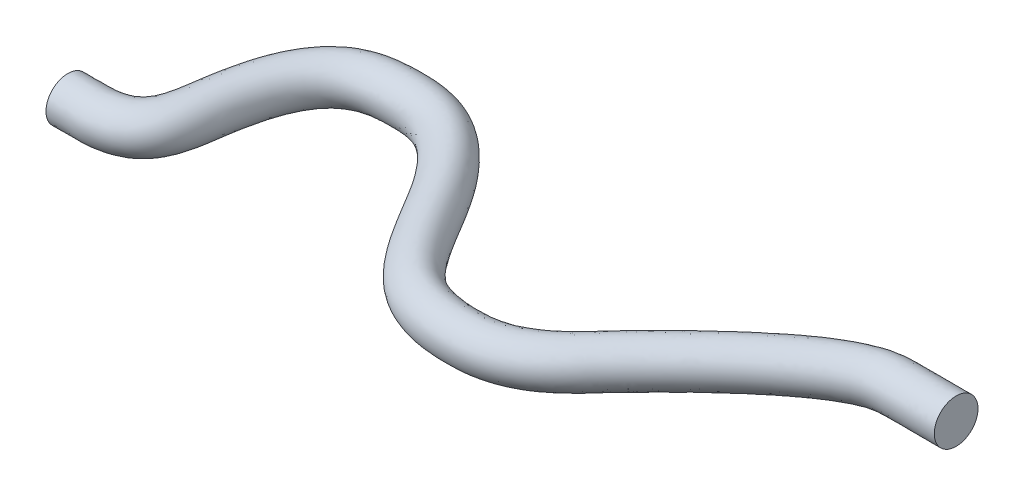
ISO-10303-21;
HEADER;
FILE_DESCRIPTION(('STEP AP214'),'2;1');
FILE_NAME('part.step','',(''),(''),'','','');
FILE_SCHEMA(('AUTOMOTIVE_DESIGN { 1 0 10303 214 1 1 1 1 }'));
ENDSEC;
DATA;
#1=APPLICATION_CONTEXT('core data for automotive mechanical design processes');
#2=APPLICATION_PROTOCOL_DEFINITION('international standard','automotive_design',2000,#1);
#3=PRODUCT_CONTEXT('',#1,'mechanical');
#4=PRODUCT('Part','Part','',(#3));
#5=PRODUCT_RELATED_PRODUCT_CATEGORY('part','',(#4));
#6=PRODUCT_DEFINITION_FORMATION('','',#4);
#7=PRODUCT_DEFINITION_CONTEXT('part definition',#1,'design');
#8=PRODUCT_DEFINITION('design','',#6,#7);
#9=PRODUCT_DEFINITION_SHAPE('','',#8);
#10=(LENGTH_UNIT() NAMED_UNIT(*) SI_UNIT(.MILLI.,.METRE.));
#11=(NAMED_UNIT(*) PLANE_ANGLE_UNIT() SI_UNIT($,.RADIAN.));
#12=(NAMED_UNIT(*) SI_UNIT($,.STERADIAN.) SOLID_ANGLE_UNIT());
#13=UNCERTAINTY_MEASURE_WITH_UNIT(LENGTH_MEASURE(1.E-05),#10,'distance_accuracy_value','');
#14=(GEOMETRIC_REPRESENTATION_CONTEXT(3) GLOBAL_UNCERTAINTY_ASSIGNED_CONTEXT((#13)) GLOBAL_UNIT_ASSIGNED_CONTEXT((#10,
#11,#12)) REPRESENTATION_CONTEXT('',''));
#15=CARTESIAN_POINT('',(0.,0.,0.));
#16=DIRECTION('',(0.,0.,1.));
#17=DIRECTION('',(1.,0.,0.));
#18=AXIS2_PLACEMENT_3D('',#15,#16,#17);
#19=CARTESIAN_POINT('',(0.,0.,2.));
#20=DIRECTION('',(-1.,0.,0.));
#21=DIRECTION('',(0.,0.,1.));
#22=AXIS2_PLACEMENT_3D('',#19,#20,#21);
#23=PLANE('',#22);
#24=CARTESIAN_POINT('',(0.,0.,0.));
#25=DIRECTION('',(1.,0.,0.));
#26=DIRECTION('',(0.,0.,-1.));
#27=AXIS2_PLACEMENT_3D('',#24,#25,#26);
#28=CIRCLE('',#27,2.);
#29=CARTESIAN_POINT('',(0.,0.,-2.));
#30=VERTEX_POINT('',#29);
#31=EDGE_CURVE('E53',#30,#30,#28,.T.);
#32=ORIENTED_EDGE('',*,*,#31,.F.);
#33=EDGE_LOOP('',(#32));
#34=FACE_BOUND('',#33,.T.);
#35=ADVANCED_FACE('F49',(#34),#23,.T.);
#36=CARTESIAN_POINT('',(66.1604814361651,0.,-13.0844175366333));
#37=DIRECTION('',(-1.,0.,0.));
#38=DIRECTION('',(0.,0.,1.));
#39=AXIS2_PLACEMENT_3D('',#36,#37,#38);
#40=PLANE('',#39);
#41=CARTESIAN_POINT('',(66.1604814361651,0.,-15.0844175366333));
#42=DIRECTION('',(-1.,0.,0.));
#43=DIRECTION('',(0.,0.,1.));
#44=AXIS2_PLACEMENT_3D('',#41,#42,#43);
#45=CIRCLE('',#44,2.);
#46=CARTESIAN_POINT('',(66.1604814361651,0.,-13.0844175366333));
#47=VERTEX_POINT('',#46);
#48=EDGE_CURVE('E11',#47,#47,#45,.T.);
#49=ORIENTED_EDGE('',*,*,#48,.F.);
#50=EDGE_LOOP('',(#49));
#51=FACE_BOUND('',#50,.T.);
#52=ADVANCED_FACE('F51',(#51),#40,.F.);
#53=CARTESIAN_POINT('',(0.,0.,-2.));
#54=CARTESIAN_POINT('',(0.576247341707407,0.,-1.99800129089098));
#55=CARTESIAN_POINT('',(1.3921594663181,0.,-2.01440466065576));
#56=CARTESIAN_POINT('',(2.17657091953829,0.,-2.01173545523365));
#57=CARTESIAN_POINT('',(2.62660835659001,0.,-1.98740789094828));
#58=CARTESIAN_POINT('',(3.30942954225005,0.,-2.06714564380435));
#59=CARTESIAN_POINT('',(3.79208372886148,0.,-2.21753338210752));
#60=CARTESIAN_POINT('',(3.99940599652082,0.,-2.3014231540369));
#61=CARTESIAN_POINT('',(4.14524590631426,0.,-2.38286606250441));
#62=CARTESIAN_POINT('',(4.30282558564287,0.,-2.50333943287402));
#63=CARTESIAN_POINT('',(4.50610598378241,0.,-2.73079492712394));
#64=CARTESIAN_POINT('',(4.7720968761298,0.,-3.2199578414801));
#65=CARTESIAN_POINT('',(5.10815723379101,0.,-4.44123534577987));
#66=CARTESIAN_POINT('',(5.30987449978381,0.,-6.14646287324118));
#67=CARTESIAN_POINT('',(5.66106121168746,0.,-8.15065923165252));
#68=CARTESIAN_POINT('',(6.04730328755896,0.,-9.83622078319194));
#69=CARTESIAN_POINT('',(6.76473971891991,0.,-12.0143126917871));
#70=CARTESIAN_POINT('',(7.73068238147757,0.,-13.8216387441997));
#71=CARTESIAN_POINT('',(8.98826168346513,0.,-15.267574026683));
#72=CARTESIAN_POINT('',(10.1223028521453,0.,-16.1577499683015));
#73=CARTESIAN_POINT('',(11.2972850092684,0.,-16.7657066545634));
#74=CARTESIAN_POINT('',(12.4389459343736,0.,-17.1324988439765));
#75=CARTESIAN_POINT('',(13.6904177543395,0.,-17.3524981694854));
#76=CARTESIAN_POINT('',(14.7017533703688,0.,-17.4102655293658));
#77=CARTESIAN_POINT('',(15.6669000401161,0.,-17.4282807444468));
#78=CARTESIAN_POINT('',(16.4789542398157,0.,-17.411045356171));
#79=CARTESIAN_POINT('',(17.5029694882764,0.,-17.3220116788886));
#80=CARTESIAN_POINT('',(18.6412976794965,0.,-17.1168479870707));
#81=CARTESIAN_POINT('',(20.0094709313657,0.,-16.6532843383645));
#82=CARTESIAN_POINT('',(21.4066836458121,0.,-15.9071458945275));
#83=CARTESIAN_POINT('',(22.803114673683,0.,-14.8518710039708));
#84=CARTESIAN_POINT('',(24.2000986434754,0.,-13.4589260781223));
#85=CARTESIAN_POINT('',(25.4768460081553,0.,-11.8648524004868));
#86=CARTESIAN_POINT('',(26.4473000656231,0.,-10.4329215442212));
#87=CARTESIAN_POINT('',(27.4666128914372,0.,-8.79774982098106));
#88=CARTESIAN_POINT('',(28.6673017882565,0.,-6.73495531726025));
#89=CARTESIAN_POINT('',(30.3406226059038,0.,-4.19383862201362));
#90=CARTESIAN_POINT('',(31.4513420326102,0.,-3.00366012658609));
#91=CARTESIAN_POINT('',(32.5556577003092,0.,-2.13064495759472));
#92=CARTESIAN_POINT('',(33.6691650821633,0.,-1.56872707707272));
#93=CARTESIAN_POINT('',(35.3991370597416,0.,-1.23469488561184));
#94=CARTESIAN_POINT('',(36.8929676916229,0.,-1.15663794314645));
#95=CARTESIAN_POINT('',(38.6698211128305,0.,-1.18945238553637));
#96=CARTESIAN_POINT('',(40.7571448276082,0.,-2.01518171579414));
#97=CARTESIAN_POINT('',(42.3110169786028,0.,-3.36030563334392));
#98=CARTESIAN_POINT('',(43.0488043562348,0.,-4.11499723280239));
#99=CARTESIAN_POINT('',(44.0585737782881,0.,-5.21009047202035));
#100=CARTESIAN_POINT('',(46.7686946432867,0.,-8.08876755763583));
#101=CARTESIAN_POINT('',(51.3476063864162,0.,-12.3576681673767));
#102=CARTESIAN_POINT('',(55.4751524289029,0.,-15.4401279815693));
#103=CARTESIAN_POINT('',(58.0738870721952,0.,-16.6343376480373));
#104=CARTESIAN_POINT('',(59.9896430588437,0.,-17.0870953393976));
#105=CARTESIAN_POINT('',(61.0690109853259,0.,-17.0990428524457));
#106=CARTESIAN_POINT('',(62.5903548071873,0.,-17.087958668524));
#107=CARTESIAN_POINT('',(63.8865238935633,0.,-17.0903161223702));
#108=CARTESIAN_POINT('',(65.2856768985329,0.,-17.0850145857712));
#109=CARTESIAN_POINT('',(66.1604814361651,0.,-17.0844175366333));
#110=CARTESIAN_POINT('',(0.,4.,-2.));
#111=CARTESIAN_POINT('',(0.576247341707407,4.,-1.99800129089098));
#112=CARTESIAN_POINT('',(1.3921594663181,4.,-2.01440466065576));
#113=CARTESIAN_POINT('',(2.17657091953829,4.,-2.01173545523365));
#114=CARTESIAN_POINT('',(2.62660835659001,4.,-1.98740789094828));
#115=CARTESIAN_POINT('',(3.30942954225005,4.,-2.06714564380435));
#116=CARTESIAN_POINT('',(3.79208372886148,4.,-2.21753338210752));
#117=CARTESIAN_POINT('',(3.99940599652082,4.,-2.3014231540369));
#118=CARTESIAN_POINT('',(4.14524590631426,4.,-2.38286606250441));
#119=CARTESIAN_POINT('',(4.30282558564287,4.,-2.50333943287402));
#120=CARTESIAN_POINT('',(4.50610598378241,4.,-2.73079492712394));
#121=CARTESIAN_POINT('',(4.7720968761298,4.,-3.2199578414801));
#122=CARTESIAN_POINT('',(5.10815723379101,4.,-4.44123534577987));
#123=CARTESIAN_POINT('',(5.30987449978381,4.,-6.14646287324117));
#124=CARTESIAN_POINT('',(5.66106121168746,4.,-8.15065923165252));
#125=CARTESIAN_POINT('',(6.04730328755896,4.,-9.83622078319194));
#126=CARTESIAN_POINT('',(6.76473971891991,4.,-12.0143126917871));
#127=CARTESIAN_POINT('',(7.73068238147756,4.,-13.8216387441997));
#128=CARTESIAN_POINT('',(8.98826168346513,4.,-15.267574026683));
#129=CARTESIAN_POINT('',(10.1223028521453,4.,-16.1577499683015));
#130=CARTESIAN_POINT('',(11.2972850092685,4.,-16.7657066545634));
#131=CARTESIAN_POINT('',(12.4389459343736,4.,-17.1324988439765));
#132=CARTESIAN_POINT('',(13.6904177543395,4.,-17.3524981694854));
#133=CARTESIAN_POINT('',(14.7017533703688,4.,-17.4102655293659));
#134=CARTESIAN_POINT('',(15.6669000401161,4.,-17.4282807444468));
#135=CARTESIAN_POINT('',(16.4789542398157,4.,-17.411045356171));
#136=CARTESIAN_POINT('',(17.5029694882764,4.,-17.3220116788886));
#137=CARTESIAN_POINT('',(18.6412976794965,4.,-17.1168479870707));
#138=CARTESIAN_POINT('',(20.0094709313657,4.,-16.6532843383645));
#139=CARTESIAN_POINT('',(21.4066836458121,4.,-15.9071458945275));
#140=CARTESIAN_POINT('',(22.803114673683,4.,-14.8518710039708));
#141=CARTESIAN_POINT('',(24.2000986434754,4.,-13.4589260781223));
#142=CARTESIAN_POINT('',(25.4768460081553,4.,-11.8648524004868));
#143=CARTESIAN_POINT('',(26.4473000656231,4.,-10.4329215442212));
#144=CARTESIAN_POINT('',(27.4666128914372,4.,-8.79774982098107));
#145=CARTESIAN_POINT('',(28.6673017882565,4.,-6.73495531726025));
#146=CARTESIAN_POINT('',(30.3406226059038,4.,-4.19383862201362));
#147=CARTESIAN_POINT('',(31.4513420326102,4.,-3.00366012658609));
#148=CARTESIAN_POINT('',(32.5556577003092,4.,-2.13064495759472));
#149=CARTESIAN_POINT('',(33.6691650821633,4.,-1.56872707707272));
#150=CARTESIAN_POINT('',(35.3991370597416,4.,-1.23469488561184));
#151=CARTESIAN_POINT('',(36.8929676916228,4.,-1.15663794314645));
#152=CARTESIAN_POINT('',(38.6698211128305,4.,-1.18945238553637));
#153=CARTESIAN_POINT('',(40.7571448276083,4.,-2.01518171579414));
#154=CARTESIAN_POINT('',(42.3110169786028,4.,-3.36030563334392));
#155=CARTESIAN_POINT('',(43.0488043562348,4.,-4.11499723280239));
#156=CARTESIAN_POINT('',(44.058573778288,4.,-5.21009047202035));
#157=CARTESIAN_POINT('',(46.7686946432867,4.,-8.08876755763583));
#158=CARTESIAN_POINT('',(51.3476063864162,4.,-12.3576681673767));
#159=CARTESIAN_POINT('',(55.4751524289029,4.,-15.4401279815693));
#160=CARTESIAN_POINT('',(58.0738870721952,4.,-16.6343376480373));
#161=CARTESIAN_POINT('',(59.9896430588437,4.,-17.0870953393976));
#162=CARTESIAN_POINT('',(61.0690109853259,4.,-17.0990428524457));
#163=CARTESIAN_POINT('',(62.5903548071873,4.,-17.087958668524));
#164=CARTESIAN_POINT('',(63.8865238935633,4.,-17.0903161223702));
#165=CARTESIAN_POINT('',(65.2856768985329,4.,-17.0850145857712));
#166=CARTESIAN_POINT('',(66.1604814361651,4.,-17.0844175366333));
#167=CARTESIAN_POINT('',(0.,4.,2.));
#168=CARTESIAN_POINT('',(0.516329915263041,4.,1.99800129089098));
#169=CARTESIAN_POINT('',(1.25551830624878,4.,1.97647926251972));
#170=CARTESIAN_POINT('',(2.26432235884609,4.,1.99626101447362));
#171=CARTESIAN_POINT('',(2.96716077920261,4.,2.0138336417967));
#172=CARTESIAN_POINT('',(4.06092971499091,4.,1.87570799372577));
#173=CARTESIAN_POINT('',(5.07186404650313,4.,1.58313452454297));
#174=CARTESIAN_POINT('',(5.71091256510153,4.,1.317725381308));
#175=CARTESIAN_POINT('',(6.33595953164428,4.,0.989833294090546));
#176=CARTESIAN_POINT('',(7.06073360865654,4.,0.428122353443539));
#177=CARTESIAN_POINT('',(7.91592107344362,4.,-0.549316605771048));
#178=CARTESIAN_POINT('',(8.57445650460704,4.,-1.88728075622531));
#179=CARTESIAN_POINT('',(9.07149777121769,4.,-3.84155649544665));
#180=CARTESIAN_POINT('',(9.28554003913438,4.,-5.60414086960802));
#181=CARTESIAN_POINT('',(9.58285672491652,4.,-7.36633213596294));
#182=CARTESIAN_POINT('',(9.90742727920916,4.,-8.77568945417334));
#183=CARTESIAN_POINT('',(10.465948589674,4.,-10.4499827280811));
#184=CARTESIAN_POINT('',(11.1075817583047,4.,-11.6074670245137));
#185=CARTESIAN_POINT('',(11.7768063663895,4.,-12.3659485225979));
#186=CARTESIAN_POINT('',(12.3061669828393,4.,-12.7778452664829));
#187=CARTESIAN_POINT('',(12.8366316719826,4.,-13.053671489673));
#188=CARTESIAN_POINT('',(13.3975818567099,4.,-13.235623701661));
#189=CARTESIAN_POINT('',(14.0950526326662,4.,-13.3653460257203));
#190=CARTESIAN_POINT('',(14.8776042986845,4.,-13.4049976795017));
#191=CARTESIAN_POINT('',(15.677620257616,4.,-13.4297518711169));
#192=CARTESIAN_POINT('',(16.2837068253218,4.,-13.4134494854446));
#193=CARTESIAN_POINT('',(16.9700838804868,4.,-13.3517217239321));
#194=CARTESIAN_POINT('',(17.6423104845553,4.,-13.228157357761));
#195=CARTESIAN_POINT('',(18.4008595852879,4.,-12.9708956336827));
#196=CARTESIAN_POINT('',(19.2206956385393,4.,-12.5375140557608));
#197=CARTESIAN_POINT('',(20.1469067622328,4.,-11.8442008561434));
#198=CARTESIAN_POINT('',(21.1934252966435,4.,-10.809116203961));
#199=CARTESIAN_POINT('',(22.2519737334773,4.,-9.49012900677604));
#200=CARTESIAN_POINT('',(23.087862852319,4.,-8.26196752261252));
#201=CARTESIAN_POINT('',(24.0220234635184,4.,-6.76132259358991));
#202=CARTESIAN_POINT('',(25.2400049185952,4.,-4.67550885243034));
#203=CARTESIAN_POINT('',(27.0874514450531,4.,-1.83827541190514));
#204=CARTESIAN_POINT('',(28.6593300563674,4.,-0.0999635902596704));
#205=CARTESIAN_POINT('',(30.4333159896534,4.,1.27899530590162));
#206=CARTESIAN_POINT('',(32.4488536887708,4.,2.3029214375405));
#207=CARTESIAN_POINT('',(34.8983342383895,4.,2.75756458769308));
#208=CARTESIAN_POINT('',(37.056149292774,4.,2.83164126585353));
#209=CARTESIAN_POINT('',(39.6861285216008,4.,2.68377086122828));
#210=CARTESIAN_POINT('',(42.8761196602072,4.,1.46797969886257));
#211=CARTESIAN_POINT('',(45.0424016964653,4.,-0.399804637498555));
#212=CARTESIAN_POINT('',(45.9733095091834,4.,-1.38618555186537));
#213=CARTESIAN_POINT('',(47.0608598043323,4.,-2.5723502734653));
#214=CARTESIAN_POINT('',(49.5665538428836,4.,-5.20748977682932));
#215=CARTESIAN_POINT('',(53.9181511761186,4.,-9.32631166331296));
#216=CARTESIAN_POINT('',(57.786597490147,4.,-12.0904011113325));
#217=CARTESIAN_POINT('',(59.3196423589111,4.,-12.8425916225017));
#218=CARTESIAN_POINT('',(60.4988212695535,4.,-13.0878967138161));
#219=CARTESIAN_POINT('',(61.2398401253435,4.,-13.0839540935642));
#220=CARTESIAN_POINT('',(62.4776838242886,4.,-13.0981423441664));
#221=CARTESIAN_POINT('',(63.9062111566503,4.,-13.0867338275431));
#222=CARTESIAN_POINT('',(65.2922393195619,4.,-13.0838204874954));
#223=CARTESIAN_POINT('',(66.1604814361651,4.,-13.0844175366333));
#224=CARTESIAN_POINT('',(0.,0.,2.));
#225=CARTESIAN_POINT('',(0.516329915263041,0.,1.99800129089098));
#226=CARTESIAN_POINT('',(1.25551830624878,0.,1.97647926251972));
#227=CARTESIAN_POINT('',(2.26432235884609,0.,1.99626101447362));
#228=CARTESIAN_POINT('',(2.96716077920261,0.,2.0138336417967));
#229=CARTESIAN_POINT('',(4.06092971499091,0.,1.87570799372577));
#230=CARTESIAN_POINT('',(5.07186404650313,0.,1.58313452454297));
#231=CARTESIAN_POINT('',(5.71091256510153,0.,1.317725381308));
#232=CARTESIAN_POINT('',(6.33595953164428,0.,0.989833294090546));
#233=CARTESIAN_POINT('',(7.06073360865654,0.,0.428122353443539));
#234=CARTESIAN_POINT('',(7.91592107344363,0.,-0.549316605771047));
#235=CARTESIAN_POINT('',(8.57445650460704,0.,-1.88728075622531));
#236=CARTESIAN_POINT('',(9.07149777121769,0.,-3.84155649544665));
#237=CARTESIAN_POINT('',(9.28554003913439,0.,-5.60414086960802));
#238=CARTESIAN_POINT('',(9.58285672491652,0.,-7.36633213596294));
#239=CARTESIAN_POINT('',(9.90742727920916,0.,-8.77568945417334));
#240=CARTESIAN_POINT('',(10.465948589674,0.,-10.4499827280811));
#241=CARTESIAN_POINT('',(11.1075817583047,0.,-11.6074670245137));
#242=CARTESIAN_POINT('',(11.7768063663895,0.,-12.3659485225979));
#243=CARTESIAN_POINT('',(12.3061669828393,0.,-12.7778452664829));
#244=CARTESIAN_POINT('',(12.8366316719826,0.,-13.053671489673));
#245=CARTESIAN_POINT('',(13.3975818567099,0.,-13.235623701661));
#246=CARTESIAN_POINT('',(14.0950526326662,0.,-13.3653460257203));
#247=CARTESIAN_POINT('',(14.8776042986845,0.,-13.4049976795017));
#248=CARTESIAN_POINT('',(15.677620257616,0.,-13.4297518711169));
#249=CARTESIAN_POINT('',(16.2837068253218,0.,-13.4134494854446));
#250=CARTESIAN_POINT('',(16.9700838804868,0.,-13.3517217239321));
#251=CARTESIAN_POINT('',(17.6423104845553,0.,-13.228157357761));
#252=CARTESIAN_POINT('',(18.4008595852879,0.,-12.9708956336827));
#253=CARTESIAN_POINT('',(19.2206956385392,0.,-12.5375140557608));
#254=CARTESIAN_POINT('',(20.1469067622328,0.,-11.8442008561434));
#255=CARTESIAN_POINT('',(21.1934252966435,0.,-10.809116203961));
#256=CARTESIAN_POINT('',(22.2519737334773,0.,-9.49012900677604));
#257=CARTESIAN_POINT('',(23.087862852319,0.,-8.26196752261252));
#258=CARTESIAN_POINT('',(24.0220234635184,0.,-6.7613225935899));
#259=CARTESIAN_POINT('',(25.2400049185952,0.,-4.67550885243034));
#260=CARTESIAN_POINT('',(27.0874514450531,0.,-1.83827541190514));
#261=CARTESIAN_POINT('',(28.6593300563674,0.,-0.0999635902596701));
#262=CARTESIAN_POINT('',(30.4333159896534,0.,1.27899530590162));
#263=CARTESIAN_POINT('',(32.4488536887708,0.,2.3029214375405));
#264=CARTESIAN_POINT('',(34.8983342383895,0.,2.75756458769308));
#265=CARTESIAN_POINT('',(37.056149292774,0.,2.83164126585353));
#266=CARTESIAN_POINT('',(39.6861285216008,0.,2.68377086122828));
#267=CARTESIAN_POINT('',(42.8761196602072,0.,1.46797969886257));
#268=CARTESIAN_POINT('',(45.0424016964653,0.,-0.399804637498555));
#269=CARTESIAN_POINT('',(45.9733095091834,0.,-1.38618555186537));
#270=CARTESIAN_POINT('',(47.0608598043323,0.,-2.5723502734653));
#271=CARTESIAN_POINT('',(49.5665538428837,0.,-5.20748977682932));
#272=CARTESIAN_POINT('',(53.9181511761186,0.,-9.32631166331295));
#273=CARTESIAN_POINT('',(57.7865974901471,0.,-12.0904011113325));
#274=CARTESIAN_POINT('',(59.3196423589111,0.,-12.8425916225017));
#275=CARTESIAN_POINT('',(60.4988212695535,0.,-13.0878967138161));
#276=CARTESIAN_POINT('',(61.2398401253435,0.,-13.0839540935642));
#277=CARTESIAN_POINT('',(62.4776838242886,0.,-13.0981423441664));
#278=CARTESIAN_POINT('',(63.9062111566503,0.,-13.0867338275431));
#279=CARTESIAN_POINT('',(65.2922393195619,0.,-13.0838204874954));
#280=CARTESIAN_POINT('',(66.1604814361651,0.,-13.0844175366333));
#281=CARTESIAN_POINT('',(0.,-4.,2.));
#282=CARTESIAN_POINT('',(0.516329915263041,-4.,1.99800129089098));
#283=CARTESIAN_POINT('',(1.25551830624878,-4.,1.97647926251972));
#284=CARTESIAN_POINT('',(2.26432235884609,-4.,1.99626101447362));
#285=CARTESIAN_POINT('',(2.96716077920261,-4.,2.0138336417967));
#286=CARTESIAN_POINT('',(4.06092971499091,-4.,1.87570799372577));
#287=CARTESIAN_POINT('',(5.07186404650313,-4.,1.58313452454297));
#288=CARTESIAN_POINT('',(5.71091256510153,-4.,1.317725381308));
#289=CARTESIAN_POINT('',(6.33595953164428,-4.,0.989833294090547));
#290=CARTESIAN_POINT('',(7.06073360865654,-4.,0.428122353443539));
#291=CARTESIAN_POINT('',(7.91592107344362,-4.,-0.549316605771047));
#292=CARTESIAN_POINT('',(8.57445650460704,-4.,-1.88728075622531));
#293=CARTESIAN_POINT('',(9.07149777121769,-4.,-3.84155649544665));
#294=CARTESIAN_POINT('',(9.28554003913438,-4.,-5.60414086960802));
#295=CARTESIAN_POINT('',(9.58285672491652,-4.,-7.36633213596294));
#296=CARTESIAN_POINT('',(9.90742727920916,-4.,-8.77568945417334));
#297=CARTESIAN_POINT('',(10.465948589674,-4.,-10.4499827280811));
#298=CARTESIAN_POINT('',(11.1075817583047,-4.,-11.6074670245137));
#299=CARTESIAN_POINT('',(11.7768063663895,-4.,-12.3659485225979));
#300=CARTESIAN_POINT('',(12.3061669828393,-4.,-12.7778452664829));
#301=CARTESIAN_POINT('',(12.8366316719826,-4.,-13.053671489673));
#302=CARTESIAN_POINT('',(13.3975818567099,-4.,-13.235623701661));
#303=CARTESIAN_POINT('',(14.0950526326662,-4.,-13.3653460257203));
#304=CARTESIAN_POINT('',(14.8776042986845,-4.,-13.4049976795017));
#305=CARTESIAN_POINT('',(15.677620257616,-4.,-13.4297518711169));
#306=CARTESIAN_POINT('',(16.2837068253218,-4.,-13.4134494854446));
#307=CARTESIAN_POINT('',(16.9700838804868,-4.,-13.3517217239321));
#308=CARTESIAN_POINT('',(17.6423104845553,-4.,-13.228157357761));
#309=CARTESIAN_POINT('',(18.4008595852879,-4.,-12.9708956336827));
#310=CARTESIAN_POINT('',(19.2206956385393,-4.,-12.5375140557608));
#311=CARTESIAN_POINT('',(20.1469067622328,-4.,-11.8442008561434));
#312=CARTESIAN_POINT('',(21.1934252966435,-4.,-10.809116203961));
#313=CARTESIAN_POINT('',(22.2519737334773,-4.,-9.49012900677604));
#314=CARTESIAN_POINT('',(23.087862852319,-4.,-8.26196752261252));
#315=CARTESIAN_POINT('',(24.0220234635184,-4.,-6.76132259358991));
#316=CARTESIAN_POINT('',(25.2400049185952,-4.,-4.67550885243034));
#317=CARTESIAN_POINT('',(27.0874514450531,-4.,-1.83827541190514));
#318=CARTESIAN_POINT('',(28.6593300563674,-4.,-0.09996359025967));
#319=CARTESIAN_POINT('',(30.4333159896534,-4.,1.27899530590162));
#320=CARTESIAN_POINT('',(32.4488536887708,-4.,2.3029214375405));
#321=CARTESIAN_POINT('',(34.8983342383895,-4.,2.75756458769308));
#322=CARTESIAN_POINT('',(37.056149292774,-4.,2.83164126585353));
#323=CARTESIAN_POINT('',(39.6861285216008,-4.,2.68377086122828));
#324=CARTESIAN_POINT('',(42.8761196602072,-4.,1.46797969886257));
#325=CARTESIAN_POINT('',(45.0424016964653,-4.,-0.399804637498555));
#326=CARTESIAN_POINT('',(45.9733095091834,-4.,-1.38618555186537));
#327=CARTESIAN_POINT('',(47.0608598043323,-4.,-2.5723502734653));
#328=CARTESIAN_POINT('',(49.5665538428836,-4.,-5.20748977682932));
#329=CARTESIAN_POINT('',(53.9181511761186,-4.,-9.32631166331296));
#330=CARTESIAN_POINT('',(57.786597490147,-4.,-12.0904011113325));
#331=CARTESIAN_POINT('',(59.3196423589111,-4.,-12.8425916225017));
#332=CARTESIAN_POINT('',(60.4988212695535,-4.,-13.0878967138161));
#333=CARTESIAN_POINT('',(61.2398401253435,-4.,-13.0839540935642));
#334=CARTESIAN_POINT('',(62.4776838242886,-4.,-13.0981423441664));
#335=CARTESIAN_POINT('',(63.9062111566503,-4.,-13.0867338275431));
#336=CARTESIAN_POINT('',(65.2922393195619,-4.,-13.0838204874954));
#337=CARTESIAN_POINT('',(66.1604814361651,-4.,-13.0844175366333));
#338=CARTESIAN_POINT('',(0.,-4.,-2.));
#339=CARTESIAN_POINT('',(0.576247341707407,-4.,-1.99800129089098));
#340=CARTESIAN_POINT('',(1.3921594663181,-4.,-2.01440466065576));
#341=CARTESIAN_POINT('',(2.17657091953829,-4.,-2.01173545523365));
#342=CARTESIAN_POINT('',(2.62660835659001,-4.,-1.98740789094828));
#343=CARTESIAN_POINT('',(3.30942954225005,-4.,-2.06714564380435));
#344=CARTESIAN_POINT('',(3.79208372886148,-4.,-2.21753338210752));
#345=CARTESIAN_POINT('',(3.99940599652082,-4.,-2.3014231540369));
#346=CARTESIAN_POINT('',(4.14524590631426,-4.,-2.38286606250441));
#347=CARTESIAN_POINT('',(4.30282558564287,-4.,-2.50333943287402));
#348=CARTESIAN_POINT('',(4.50610598378241,-4.,-2.73079492712394));
#349=CARTESIAN_POINT('',(4.7720968761298,-4.,-3.2199578414801));
#350=CARTESIAN_POINT('',(5.10815723379101,-4.,-4.44123534577987));
#351=CARTESIAN_POINT('',(5.30987449978381,-4.,-6.14646287324117));
#352=CARTESIAN_POINT('',(5.66106121168746,-4.,-8.15065923165252));
#353=CARTESIAN_POINT('',(6.04730328755896,-4.,-9.83622078319194));
#354=CARTESIAN_POINT('',(6.76473971891991,-4.,-12.0143126917871));
#355=CARTESIAN_POINT('',(7.73068238147756,-4.,-13.8216387441997));
#356=CARTESIAN_POINT('',(8.98826168346513,-4.,-15.267574026683));
#357=CARTESIAN_POINT('',(10.1223028521453,-4.,-16.1577499683015));
#358=CARTESIAN_POINT('',(11.2972850092685,-4.,-16.7657066545634));
#359=CARTESIAN_POINT('',(12.4389459343736,-4.,-17.1324988439765));
#360=CARTESIAN_POINT('',(13.6904177543395,-4.,-17.3524981694854));
#361=CARTESIAN_POINT('',(14.7017533703688,-4.,-17.4102655293659));
#362=CARTESIAN_POINT('',(15.6669000401161,-4.,-17.4282807444468));
#363=CARTESIAN_POINT('',(16.4789542398157,-4.,-17.411045356171));
#364=CARTESIAN_POINT('',(17.5029694882764,-4.,-17.3220116788886));
#365=CARTESIAN_POINT('',(18.6412976794965,-4.,-17.1168479870707));
#366=CARTESIAN_POINT('',(20.0094709313657,-4.,-16.6532843383645));
#367=CARTESIAN_POINT('',(21.4066836458121,-4.,-15.9071458945275));
#368=CARTESIAN_POINT('',(22.803114673683,-4.,-14.8518710039708));
#369=CARTESIAN_POINT('',(24.2000986434754,-4.,-13.4589260781223));
#370=CARTESIAN_POINT('',(25.4768460081553,-4.,-11.8648524004868));
#371=CARTESIAN_POINT('',(26.4473000656231,-4.,-10.4329215442212));
#372=CARTESIAN_POINT('',(27.4666128914372,-4.,-8.79774982098107));
#373=CARTESIAN_POINT('',(28.6673017882565,-4.,-6.73495531726025));
#374=CARTESIAN_POINT('',(30.3406226059038,-4.,-4.19383862201362));
#375=CARTESIAN_POINT('',(31.4513420326102,-4.,-3.00366012658609));
#376=CARTESIAN_POINT('',(32.5556577003092,-4.,-2.13064495759472));
#377=CARTESIAN_POINT('',(33.6691650821633,-4.,-1.56872707707272));
#378=CARTESIAN_POINT('',(35.3991370597416,-4.,-1.23469488561184));
#379=CARTESIAN_POINT('',(36.8929676916228,-4.,-1.15663794314645));
#380=CARTESIAN_POINT('',(38.6698211128305,-4.,-1.18945238553637));
#381=CARTESIAN_POINT('',(40.7571448276083,-4.,-2.01518171579414));
#382=CARTESIAN_POINT('',(42.3110169786028,-4.,-3.36030563334392));
#383=CARTESIAN_POINT('',(43.0488043562348,-4.,-4.11499723280239));
#384=CARTESIAN_POINT('',(44.058573778288,-4.,-5.21009047202035));
#385=CARTESIAN_POINT('',(46.7686946432867,-4.,-8.08876755763583));
#386=CARTESIAN_POINT('',(51.3476063864162,-4.,-12.3576681673767));
#387=CARTESIAN_POINT('',(55.4751524289029,-4.,-15.4401279815693));
#388=CARTESIAN_POINT('',(58.0738870721952,-4.,-16.6343376480373));
#389=CARTESIAN_POINT('',(59.9896430588437,-4.,-17.0870953393976));
#390=CARTESIAN_POINT('',(61.0690109853259,-4.,-17.0990428524457));
#391=CARTESIAN_POINT('',(62.5903548071873,-4.,-17.087958668524));
#392=CARTESIAN_POINT('',(63.8865238935633,-4.,-17.0903161223702));
#393=CARTESIAN_POINT('',(65.2856768985329,-4.,-17.0850145857712));
#394=CARTESIAN_POINT('',(66.1604814361651,-4.,-17.0844175366333));
#395=CARTESIAN_POINT('',(0.,0.,-2.));
#396=CARTESIAN_POINT('',(0.576247341707407,0.,-1.99800129089098));
#397=CARTESIAN_POINT('',(1.3921594663181,0.,-2.01440466065576));
#398=CARTESIAN_POINT('',(2.17657091953829,0.,-2.01173545523365));
#399=CARTESIAN_POINT('',(2.62660835659001,0.,-1.98740789094828));
#400=CARTESIAN_POINT('',(3.30942954225005,0.,-2.06714564380435));
#401=CARTESIAN_POINT('',(3.79208372886148,0.,-2.21753338210752));
#402=CARTESIAN_POINT('',(3.99940599652082,0.,-2.3014231540369));
#403=CARTESIAN_POINT('',(4.14524590631426,0.,-2.38286606250441));
#404=CARTESIAN_POINT('',(4.30282558564287,0.,-2.50333943287402));
#405=CARTESIAN_POINT('',(4.50610598378241,0.,-2.73079492712394));
#406=CARTESIAN_POINT('',(4.7720968761298,0.,-3.2199578414801));
#407=CARTESIAN_POINT('',(5.10815723379101,0.,-4.44123534577987));
#408=CARTESIAN_POINT('',(5.30987449978381,0.,-6.14646287324118));
#409=CARTESIAN_POINT('',(5.66106121168746,0.,-8.15065923165252));
#410=CARTESIAN_POINT('',(6.04730328755896,0.,-9.83622078319194));
#411=CARTESIAN_POINT('',(6.76473971891991,0.,-12.0143126917871));
#412=CARTESIAN_POINT('',(7.73068238147757,0.,-13.8216387441997));
#413=CARTESIAN_POINT('',(8.98826168346513,0.,-15.267574026683));
#414=CARTESIAN_POINT('',(10.1223028521453,0.,-16.1577499683015));
#415=CARTESIAN_POINT('',(11.2972850092684,0.,-16.7657066545634));
#416=CARTESIAN_POINT('',(12.4389459343736,0.,-17.1324988439765));
#417=CARTESIAN_POINT('',(13.6904177543395,0.,-17.3524981694854));
#418=CARTESIAN_POINT('',(14.7017533703688,0.,-17.4102655293658));
#419=CARTESIAN_POINT('',(15.6669000401161,0.,-17.4282807444468));
#420=CARTESIAN_POINT('',(16.4789542398157,0.,-17.411045356171));
#421=CARTESIAN_POINT('',(17.5029694882764,0.,-17.3220116788886));
#422=CARTESIAN_POINT('',(18.6412976794965,0.,-17.1168479870707));
#423=CARTESIAN_POINT('',(20.0094709313657,0.,-16.6532843383645));
#424=CARTESIAN_POINT('',(21.4066836458121,0.,-15.9071458945275));
#425=CARTESIAN_POINT('',(22.803114673683,0.,-14.8518710039708));
#426=CARTESIAN_POINT('',(24.2000986434754,0.,-13.4589260781223));
#427=CARTESIAN_POINT('',(25.4768460081553,0.,-11.8648524004868));
#428=CARTESIAN_POINT('',(26.4473000656231,0.,-10.4329215442212));
#429=CARTESIAN_POINT('',(27.4666128914372,0.,-8.79774982098106));
#430=CARTESIAN_POINT('',(28.6673017882565,0.,-6.73495531726025));
#431=CARTESIAN_POINT('',(30.3406226059038,0.,-4.19383862201362));
#432=CARTESIAN_POINT('',(31.4513420326102,0.,-3.00366012658609));
#433=CARTESIAN_POINT('',(32.5556577003092,0.,-2.13064495759472));
#434=CARTESIAN_POINT('',(33.6691650821633,0.,-1.56872707707272));
#435=CARTESIAN_POINT('',(35.3991370597416,0.,-1.23469488561184));
#436=CARTESIAN_POINT('',(36.8929676916229,0.,-1.15663794314645));
#437=CARTESIAN_POINT('',(38.6698211128305,0.,-1.18945238553637));
#438=CARTESIAN_POINT('',(40.7571448276082,0.,-2.01518171579414));
#439=CARTESIAN_POINT('',(42.3110169786028,0.,-3.36030563334392));
#440=CARTESIAN_POINT('',(43.0488043562348,0.,-4.11499723280239));
#441=CARTESIAN_POINT('',(44.0585737782881,0.,-5.21009047202035));
#442=CARTESIAN_POINT('',(46.7686946432867,0.,-8.08876755763583));
#443=CARTESIAN_POINT('',(51.3476063864162,0.,-12.3576681673767));
#444=CARTESIAN_POINT('',(55.4751524289029,0.,-15.4401279815693));
#445=CARTESIAN_POINT('',(58.0738870721952,0.,-16.6343376480373));
#446=CARTESIAN_POINT('',(59.9896430588437,0.,-17.0870953393976));
#447=CARTESIAN_POINT('',(61.0690109853259,0.,-17.0990428524457));
#448=CARTESIAN_POINT('',(62.5903548071873,0.,-17.087958668524));
#449=CARTESIAN_POINT('',(63.8865238935633,0.,-17.0903161223702));
#450=CARTESIAN_POINT('',(65.2856768985329,0.,-17.0850145857712));
#451=CARTESIAN_POINT('',(66.1604814361651,0.,-17.0844175366333));
#452=(BOUNDED_SURFACE() B_SPLINE_SURFACE(3,3,((#53,#54,#55,#56,#57,#58,#59,#60,#61,#62,#63,#64,
#65,#66,#67,#68,#69,#70,#71,#72,#73,#74,#75,#76,#77,#78,#79,#80,#81,#82,#83,#84,#85,#86,#87,#88,
#89,#90,#91,#92,#93,#94,#95,#96,#97,#98,#99,#100,#101,#102,#103,#104,#105,#106,#107,#108,#109),
(#110,#111,#112,#113,#114,#115,#116,#117,#118,#119,#120,#121,#122,#123,#124,#125,#126,#127,#128,
#129,#130,#131,#132,#133,#134,#135,#136,#137,#138,#139,#140,#141,#142,#143,#144,#145,#146,#147,
#148,#149,#150,#151,#152,#153,#154,#155,#156,#157,#158,#159,#160,#161,#162,#163,#164,#165,#166),
(#167,#168,#169,#170,#171,#172,#173,#174,#175,#176,#177,#178,#179,#180,#181,#182,#183,#184,#185,
#186,#187,#188,#189,#190,#191,#192,#193,#194,#195,#196,#197,#198,#199,#200,#201,#202,#203,#204,
#205,#206,#207,#208,#209,#210,#211,#212,#213,#214,#215,#216,#217,#218,#219,#220,#221,#222,#223),
(#224,#225,#226,#227,#228,#229,#230,#231,#232,#233,#234,#235,#236,#237,#238,#239,#240,#241,#242,
#243,#244,#245,#246,#247,#248,#249,#250,#251,#252,#253,#254,#255,#256,#257,#258,#259,#260,#261,
#262,#263,#264,#265,#266,#267,#268,#269,#270,#271,#272,#273,#274,#275,#276,#277,#278,#279,#280),
(#281,#282,#283,#284,#285,#286,#287,#288,#289,#290,#291,#292,#293,#294,#295,#296,#297,#298,#299,
#300,#301,#302,#303,#304,#305,#306,#307,#308,#309,#310,#311,#312,#313,#314,#315,#316,#317,#318,
#319,#320,#321,#322,#323,#324,#325,#326,#327,#328,#329,#330,#331,#332,#333,#334,#335,#336,#337),
(#338,#339,#340,#341,#342,#343,#344,#345,#346,#347,#348,#349,#350,#351,#352,#353,#354,#355,#356,
#357,#358,#359,#360,#361,#362,#363,#364,#365,#366,#367,#368,#369,#370,#371,#372,#373,#374,#375,
#376,#377,#378,#379,#380,#381,#382,#383,#384,#385,#386,#387,#388,#389,#390,#391,#392,#393,#394),
(#395,#396,#397,#398,#399,#400,#401,#402,#403,#404,#405,#406,#407,#408,#409,#410,#411,#412,#413,
#414,#415,#416,#417,#418,#419,#420,#421,#422,#423,#424,#425,#426,#427,#428,#429,#430,#431,#432,
#433,#434,#435,#436,#437,#438,#439,#440,#441,#442,#443,#444,#445,#446,#447,#448,#449,#450,
#451)),.UNSPECIFIED.,.T.,.F.,.F.) B_SPLINE_SURFACE_WITH_KNOTS((4,3,4),(4,1,1,1,1,1,1,1,1,1,1,1,
1,1,1,1,1,1,1,1,1,1,1,1,1,1,1,1,1,1,1,1,1,1,1,1,1,1,1,1,1,1,1,1,1,1,1,1,1,1,1,1,1,1,4),(0.,0.5,
1.),(0.,0.015625,0.0200076740445969,0.0236379491005376,0.03125,0.03515625,0.0363027505594069,
0.0390625,0.04296875,0.046875,0.0546875,0.0625,0.0760239408464694,0.0833333333333287,
0.094462488378321,0.104166666666667,0.125,0.1375,0.15,0.1625,0.174999999999998,0.1875,
0.206663143933523,0.21875,0.237051103090607,0.250000000000001,0.27,0.290000000000007,0.31,
0.330000000000001,0.35,0.37,0.384316998004763,0.39,0.412,0.434,0.455237250365884,0.456,0.478,
0.5,0.513919343966802,0.531103619444443,0.57,0.616415962286978,0.64,0.65317293470722,
0.710000000000001,0.78,0.824,0.861916371226619,0.867999999999876,0.899208370712389,0.912,0.956,
1.),.UNSPECIFIED.) GEOMETRIC_REPRESENTATION_ITEM() RATIONAL_B_SPLINE_SURFACE(((1.,1.,1.,1.,1.,
1.,1.,1.,1.,1.,1.,1.,1.,1.,1.,1.,1.,1.,1.,1.,1.,1.,1.,1.,1.,1.,1.,1.,1.,1.,1.,1.,1.,1.,1.,1.,1.,
1.,1.,1.,1.,1.,1.,1.,1.,1.,1.,1.,1.,1.,1.,1.,1.,1.,1.,1.,1.),(0.333333333333333,
0.333333333333333,0.333333333333333,0.333333333333333,0.333333333333333,0.333333333333333,
0.333333333333333,0.333333333333333,0.333333333333333,0.333333333333333,0.333333333333333,
0.333333333333333,0.333333333333334,0.333333333333333,0.333333333333333,0.333333333333333,
0.333333333333333,0.333333333333333,0.333333333333333,0.333333333333333,0.333333333333333,
0.333333333333333,0.333333333333333,0.333333333333333,0.333333333333333,0.333333333333333,
0.333333333333333,0.333333333333333,0.333333333333334,0.333333333333333,0.333333333333333,
0.333333333333333,0.333333333333333,0.333333333333333,0.333333333333333,0.333333333333333,
0.333333333333333,0.333333333333333,0.333333333333333,0.333333333333333,0.333333333333333,
0.333333333333333,0.333333333333333,0.333333333333333,0.333333333333333,0.333333333333333,
0.333333333333333,0.333333333333333,0.333333333333333,0.333333333333333,0.333333333333333,
0.333333333333333,0.333333333333333,0.333333333333333,0.333333333333333,0.333333333333333,
0.333333333333333),(0.333333333333333,0.333333333333333,0.333333333333333,0.333333333333333,
0.333333333333333,0.333333333333333,0.333333333333333,0.333333333333333,0.333333333333333,
0.333333333333333,0.333333333333333,0.333333333333333,0.333333333333334,0.333333333333333,
0.333333333333333,0.333333333333333,0.333333333333333,0.333333333333333,0.333333333333333,
0.333333333333333,0.333333333333333,0.333333333333333,0.333333333333333,0.333333333333333,
0.333333333333333,0.333333333333333,0.333333333333333,0.333333333333333,0.333333333333334,
0.333333333333333,0.333333333333333,0.333333333333333,0.333333333333333,0.333333333333333,
0.333333333333333,0.333333333333333,0.333333333333333,0.333333333333333,0.333333333333333,
0.333333333333333,0.333333333333333,0.333333333333333,0.333333333333333,0.333333333333333,
0.333333333333333,0.333333333333333,0.333333333333333,0.333333333333333,0.333333333333333,
0.333333333333333,0.333333333333333,0.333333333333333,0.333333333333333,0.333333333333333,
0.333333333333333,0.333333333333333,0.333333333333333),(1.,1.,1.,1.,1.,1.,1.,1.,1.,1.,1.,1.,1.,
1.,1.,1.,1.,1.,1.,1.,1.,1.,1.,1.,1.,1.,1.,1.,1.,1.,1.,1.,1.,1.,1.,1.,1.,1.,1.,1.,1.,1.,1.,1.,1.,
1.,1.,1.,1.,1.,1.,1.,1.,1.,1.,1.,1.),(0.333333333333333,0.333333333333333,0.333333333333333,
0.333333333333333,0.333333333333333,0.333333333333333,0.333333333333333,0.333333333333333,
0.333333333333333,0.333333333333333,0.333333333333333,0.333333333333333,0.333333333333334,
0.333333333333333,0.333333333333333,0.333333333333333,0.333333333333333,0.333333333333333,
0.333333333333333,0.333333333333333,0.333333333333333,0.333333333333333,0.333333333333333,
0.333333333333333,0.333333333333333,0.333333333333333,0.333333333333333,0.333333333333333,
0.333333333333334,0.333333333333333,0.333333333333333,0.333333333333333,0.333333333333333,
0.333333333333333,0.333333333333333,0.333333333333333,0.333333333333333,0.333333333333333,
0.333333333333333,0.333333333333333,0.333333333333333,0.333333333333333,0.333333333333333,
0.333333333333333,0.333333333333333,0.333333333333333,0.333333333333333,0.333333333333333,
0.333333333333333,0.333333333333333,0.333333333333333,0.333333333333333,0.333333333333333,
0.333333333333333,0.333333333333333,0.333333333333333,0.333333333333333),(0.333333333333333,
0.333333333333333,0.333333333333333,0.333333333333333,0.333333333333333,0.333333333333333,
0.333333333333333,0.333333333333333,0.333333333333333,0.333333333333333,0.333333333333333,
0.333333333333333,0.333333333333334,0.333333333333333,0.333333333333333,0.333333333333333,
0.333333333333333,0.333333333333333,0.333333333333333,0.333333333333333,0.333333333333333,
0.333333333333333,0.333333333333333,0.333333333333333,0.333333333333333,0.333333333333333,
0.333333333333333,0.333333333333333,0.333333333333334,0.333333333333333,0.333333333333333,
0.333333333333333,0.333333333333333,0.333333333333333,0.333333333333333,0.333333333333333,
0.333333333333333,0.333333333333333,0.333333333333333,0.333333333333333,0.333333333333333,
0.333333333333333,0.333333333333333,0.333333333333333,0.333333333333333,0.333333333333333,
0.333333333333333,0.333333333333333,0.333333333333333,0.333333333333333,0.333333333333333,
0.333333333333333,0.333333333333333,0.333333333333333,0.333333333333333,0.333333333333333,
0.333333333333333),(1.,1.,1.,1.,1.,1.,1.,1.,1.,1.,1.,1.,1.,1.,1.,1.,1.,1.,1.,1.,1.,1.,1.,1.,1.,
1.,1.,1.,1.,1.,1.,1.,1.,1.,1.,1.,1.,1.,1.,1.,1.,1.,1.,1.,1.,1.,1.,1.,1.,1.,1.,1.,1.,1.,1.,1.,1.))) REPRESENTATION_ITEM('') SURFACE());
#453=ORIENTED_EDGE('',*,*,#31,.T.);
#454=EDGE_LOOP('',(#453));
#455=FACE_BOUND('',#454,.T.);
#456=ORIENTED_EDGE('',*,*,#48,.T.);
#457=EDGE_LOOP('',(#456));
#458=FACE_BOUND('',#457,.T.);
#459=ADVANCED_FACE('F62',(#455,#458),#452,.T.);
#460=CLOSED_SHELL('',(#35,#52,#459));
#461=MANIFOLD_SOLID_BREP('B2',#460);
#462=ADVANCED_BREP_SHAPE_REPRESENTATION('',(#18,#461),#14);
#463=SHAPE_DEFINITION_REPRESENTATION(#9,#462);
ENDSEC;
END-ISO-10303-21;
